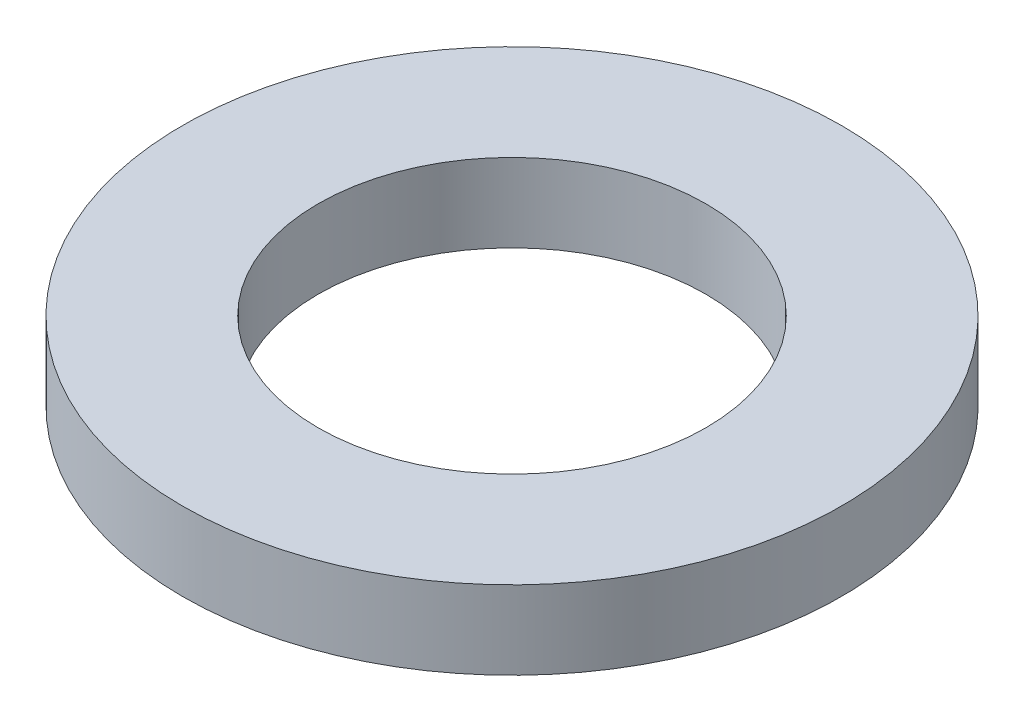
ISO-10303-21;
HEADER;
FILE_DESCRIPTION(('STEP AP214'),'2;1');
FILE_NAME('part.step','',(''),(''),'','','');
FILE_SCHEMA(('AUTOMOTIVE_DESIGN { 1 0 10303 214 1 1 1 1 }'));
ENDSEC;
DATA;
#1=APPLICATION_CONTEXT('core data for automotive mechanical design processes');
#2=APPLICATION_PROTOCOL_DEFINITION('international standard','automotive_design',2000,#1);
#3=PRODUCT_CONTEXT('',#1,'mechanical');
#4=PRODUCT('Part','Part','',(#3));
#5=PRODUCT_RELATED_PRODUCT_CATEGORY('part','',(#4));
#6=PRODUCT_DEFINITION_FORMATION('','',#4);
#7=PRODUCT_DEFINITION_CONTEXT('part definition',#1,'design');
#8=PRODUCT_DEFINITION('design','',#6,#7);
#9=PRODUCT_DEFINITION_SHAPE('','',#8);
#10=(LENGTH_UNIT() NAMED_UNIT(*) SI_UNIT(.MILLI.,.METRE.));
#11=(NAMED_UNIT(*) PLANE_ANGLE_UNIT() SI_UNIT($,.RADIAN.));
#12=(NAMED_UNIT(*) SI_UNIT($,.STERADIAN.) SOLID_ANGLE_UNIT());
#13=UNCERTAINTY_MEASURE_WITH_UNIT(LENGTH_MEASURE(1.E-05),#10,'distance_accuracy_value','');
#14=(GEOMETRIC_REPRESENTATION_CONTEXT(3) GLOBAL_UNCERTAINTY_ASSIGNED_CONTEXT((#13)) GLOBAL_UNIT_ASSIGNED_CONTEXT((#10,
#11,#12)) REPRESENTATION_CONTEXT('',''));
#15=CARTESIAN_POINT('',(0.,0.,0.));
#16=DIRECTION('',(0.,0.,1.));
#17=DIRECTION('',(1.,0.,0.));
#18=AXIS2_PLACEMENT_3D('',#15,#16,#17);
#19=CARTESIAN_POINT('',(0.,2.6416,0.));
#20=DIRECTION('',(0.,-1.,0.));
#21=DIRECTION('',(0.,0.,-1.));
#22=AXIS2_PLACEMENT_3D('',#19,#20,#21);
#23=CYLINDRICAL_SURFACE('',#22,11.1125);
#24=CARTESIAN_POINT('',(0.,2.6416,0.));
#25=DIRECTION('',(0.,1.,0.));
#26=DIRECTION('',(0.,0.,1.));
#27=AXIS2_PLACEMENT_3D('',#24,#25,#26);
#28=CIRCLE('',#27,11.1125);
#29=CARTESIAN_POINT('',(0.,2.6416,11.1125));
#30=VERTEX_POINT('',#29);
#31=EDGE_CURVE('E10',#30,#30,#28,.T.);
#32=ORIENTED_EDGE('',*,*,#31,.F.);
#33=EDGE_LOOP('',(#32));
#34=FACE_BOUND('',#33,.T.);
#35=CARTESIAN_POINT('',(0.,0.,0.));
#36=DIRECTION('',(0.,1.,0.));
#37=DIRECTION('',(0.,0.,1.));
#38=AXIS2_PLACEMENT_3D('',#35,#36,#37);
#39=CIRCLE('',#38,11.1125);
#40=CARTESIAN_POINT('',(0.,0.,11.1125));
#41=VERTEX_POINT('',#40);
#42=EDGE_CURVE('E33',#41,#41,#39,.T.);
#43=ORIENTED_EDGE('',*,*,#42,.T.);
#44=EDGE_LOOP('',(#43));
#45=FACE_BOUND('',#44,.T.);
#46=ADVANCED_FACE('F30',(#34,#45),#23,.T.);
#47=CARTESIAN_POINT('',(0.,2.6416,0.));
#48=DIRECTION('',(0.,1.,0.));
#49=DIRECTION('',(0.,0.,1.));
#50=AXIS2_PLACEMENT_3D('',#47,#48,#49);
#51=PLANE('',#50);
#52=CARTESIAN_POINT('',(0.,2.6416,0.));
#53=DIRECTION('',(0.,1.,0.));
#54=DIRECTION('',(0.,0.,1.));
#55=AXIS2_PLACEMENT_3D('',#52,#53,#54);
#56=CIRCLE('',#55,6.5405);
#57=CARTESIAN_POINT('',(0.,2.6416,6.5405));
#58=VERTEX_POINT('',#57);
#59=EDGE_CURVE('E42',#58,#58,#56,.T.);
#60=ORIENTED_EDGE('',*,*,#59,.F.);
#61=EDGE_LOOP('',(#60));
#62=FACE_BOUND('',#61,.T.);
#63=ORIENTED_EDGE('',*,*,#31,.T.);
#64=EDGE_LOOP('',(#63));
#65=FACE_BOUND('',#64,.T.);
#66=ADVANCED_FACE('F57',(#62,#65),#51,.T.);
#67=CARTESIAN_POINT('',(0.,0.,0.));
#68=DIRECTION('',(0.,1.,0.));
#69=DIRECTION('',(0.,0.,1.));
#70=AXIS2_PLACEMENT_3D('',#67,#68,#69);
#71=PLANE('',#70);
#72=CARTESIAN_POINT('',(0.,0.,0.));
#73=DIRECTION('',(0.,1.,0.));
#74=DIRECTION('',(0.,0.,1.));
#75=AXIS2_PLACEMENT_3D('',#72,#73,#74);
#76=CIRCLE('',#75,6.5405);
#77=CARTESIAN_POINT('',(0.,0.,6.5405));
#78=VERTEX_POINT('',#77);
#79=EDGE_CURVE('E40',#78,#78,#76,.T.);
#80=ORIENTED_EDGE('',*,*,#79,.T.);
#81=EDGE_LOOP('',(#80));
#82=FACE_BOUND('',#81,.T.);
#83=ORIENTED_EDGE('',*,*,#42,.F.);
#84=EDGE_LOOP('',(#83));
#85=FACE_BOUND('',#84,.T.);
#86=ADVANCED_FACE('F48',(#82,#85),#71,.F.);
#87=CARTESIAN_POINT('',(0.,0.,0.));
#88=DIRECTION('',(0.,1.,0.));
#89=DIRECTION('',(0.,0.,1.));
#90=AXIS2_PLACEMENT_3D('',#87,#88,#89);
#91=CYLINDRICAL_SURFACE('',#90,6.5405);
#92=ORIENTED_EDGE('',*,*,#79,.F.);
#93=EDGE_LOOP('',(#92));
#94=FACE_BOUND('',#93,.T.);
#95=ORIENTED_EDGE('',*,*,#59,.T.);
#96=EDGE_LOOP('',(#95));
#97=FACE_BOUND('',#96,.T.);
#98=ADVANCED_FACE('F51',(#94,#97),#91,.F.);
#99=CLOSED_SHELL('',(#46,#66,#86,#98));
#100=MANIFOLD_SOLID_BREP('B2',#99);
#101=ADVANCED_BREP_SHAPE_REPRESENTATION('',(#18,#100),#14);
#102=SHAPE_DEFINITION_REPRESENTATION(#9,#101);
ENDSEC;
END-ISO-10303-21;
